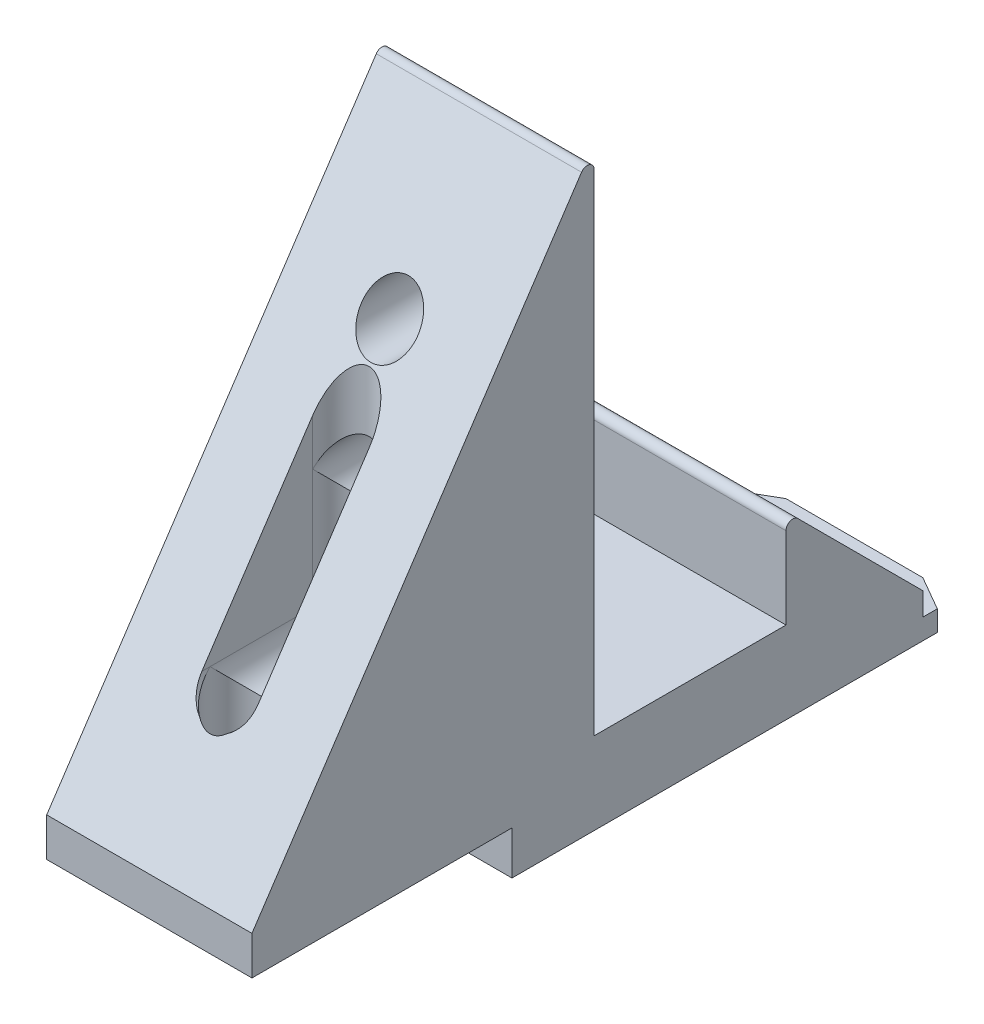
ISO-10303-21;
HEADER;
FILE_DESCRIPTION(('STEP AP214'),'2;1');
FILE_NAME('part.step','',(''),(''),'','','');
FILE_SCHEMA(('AUTOMOTIVE_DESIGN { 1 0 10303 214 1 1 1 1 }'));
ENDSEC;
DATA;
#1=APPLICATION_CONTEXT('core data for automotive mechanical design processes');
#2=APPLICATION_PROTOCOL_DEFINITION('international standard','automotive_design',2000,#1);
#3=PRODUCT_CONTEXT('',#1,'mechanical');
#4=PRODUCT('Part','Part','',(#3));
#5=PRODUCT_RELATED_PRODUCT_CATEGORY('part','',(#4));
#6=PRODUCT_DEFINITION_FORMATION('','',#4);
#7=PRODUCT_DEFINITION_CONTEXT('part definition',#1,'design');
#8=PRODUCT_DEFINITION('design','',#6,#7);
#9=PRODUCT_DEFINITION_SHAPE('','',#8);
#10=(LENGTH_UNIT() NAMED_UNIT(*) SI_UNIT(.MILLI.,.METRE.));
#11=(NAMED_UNIT(*) PLANE_ANGLE_UNIT() SI_UNIT($,.RADIAN.));
#12=(NAMED_UNIT(*) SI_UNIT($,.STERADIAN.) SOLID_ANGLE_UNIT());
#13=UNCERTAINTY_MEASURE_WITH_UNIT(LENGTH_MEASURE(1.E-05),#10,'distance_accuracy_value','');
#14=(GEOMETRIC_REPRESENTATION_CONTEXT(3) GLOBAL_UNCERTAINTY_ASSIGNED_CONTEXT((#13)) GLOBAL_UNIT_ASSIGNED_CONTEXT((#10,
#11,#12)) REPRESENTATION_CONTEXT('',''));
#15=CARTESIAN_POINT('',(0.,0.,0.));
#16=DIRECTION('',(0.,0.,1.));
#17=DIRECTION('',(1.,0.,0.));
#18=AXIS2_PLACEMENT_3D('',#15,#16,#17);
#19=CARTESIAN_POINT('',(0.,23.347224362268,45.35));
#20=DIRECTION('',(0.,0.,-1.));
#21=DIRECTION('',(-1.,0.,0.));
#22=AXIS2_PLACEMENT_3D('',#19,#20,#21);
#23=CYLINDRICAL_SURFACE('',#22,4.125);
#24=DIRECTION('',(0.,0.,1.));
#25=VECTOR('',#24,1.);
#26=CARTESIAN_POINT('',(4.125,23.347224362268,0.));
#27=LINE('',#26,#25);
#28=CARTESIAN_POINT('',(4.125,23.347224362268,37.));
#29=VERTEX_POINT('',#28);
#30=CARTESIAN_POINT('',(4.125,23.347224362268,38.2018504251547));
#31=VERTEX_POINT('',#30);
#32=EDGE_CURVE('E417',#29,#31,#27,.T.);
#33=ORIENTED_EDGE('',*,*,#32,.F.);
#34=CARTESIAN_POINT('',(0.,23.347224362268,37.));
#35=DIRECTION('',(0.,-0.707106781186547,-0.707106781186547));
#36=DIRECTION('',(0.,0.707106781186547,-0.707106781186547));
#37=AXIS2_PLACEMENT_3D('',#34,#35,#36);
#38=ELLIPSE('',#37,5.83363094478902,4.125);
#39=CARTESIAN_POINT('',(2.00390244273514,19.741673086804,40.605551275464));
#40=VERTEX_POINT('',#39);
#41=EDGE_CURVE('E363',#29,#40,#38,.T.);
#42=ORIENTED_EDGE('',*,*,#41,.T.);
#43=CARTESIAN_POINT('',(0.,23.347224362268,38.2018504251547));
#44=DIRECTION('',(0.,-0.554700196225229,-0.832050294337844));
#45=DIRECTION('',(0.,0.832050294337844,-0.554700196225229));
#46=AXIS2_PLACEMENT_3D('',#43,#44,#45);
#47=ELLIPSE('',#46,4.95763300376299,4.125);
#48=EDGE_CURVE('E328',#31,#40,#47,.T.);
#49=ORIENTED_EDGE('',*,*,#48,.F.);
#50=EDGE_LOOP('',(#33,#42,#49));
#51=FACE_BOUND('',#50,.T.);
#52=ADVANCED_FACE('F47',(#51),#23,.F.);
#53=CARTESIAN_POINT('',(15.,5.65,50.));
#54=DIRECTION('',(0.,-0.554700196225229,-0.832050294337844));
#55=DIRECTION('',(0.,0.832050294337844,-0.554700196225229));
#56=AXIS2_PLACEMENT_3D('',#53,#54,#55);
#57=PLANE('',#56);
#58=CARTESIAN_POINT('',(0.,58.347224362268,14.8685170918213));
#59=DIRECTION('',(0.,-0.554700196225229,-0.832050294337844));
#60=DIRECTION('',(0.,0.832050294337844,-0.554700196225229));
#61=AXIS2_PLACEMENT_3D('',#58,#59,#60);
#62=ELLIPSE('',#61,4.95763300376299,4.125);
#63=CARTESIAN_POINT('',(0.,62.472224362268,12.1185170918213));
#64=VERTEX_POINT('',#63);
#65=EDGE_CURVE('E329',#64,#64,#62,.T.);
#66=ORIENTED_EDGE('',*,*,#65,.T.);
#67=EDGE_LOOP('',(#66));
#68=FACE_BOUND('',#67,.T.);
#69=DIRECTION('',(0.,-0.832050294337844,0.554700196225229));
#70=VECTOR('',#69,1.);
#71=CARTESIAN_POINT('',(15.,5.65,50.));
#72=LINE('',#71,#70);
#73=CARTESIAN_POINT('',(15.,77.9019245584932,1.83205029433785));
#74=VERTEX_POINT('',#73);
#75=CARTESIAN_POINT('',(15.,5.65,50.));
#76=VERTEX_POINT('',#75);
#77=EDGE_CURVE('E270',#74,#76,#72,.T.);
#78=ORIENTED_EDGE('',*,*,#77,.F.);
#79=DIRECTION('',(-1.,0.,0.));
#80=VECTOR('',#79,1.);
#81=CARTESIAN_POINT('',(15.,77.9019245584932,1.83205029433785));
#82=LINE('',#81,#80);
#83=CARTESIAN_POINT('',(-15.,77.9019245584932,1.83205029433785));
#84=VERTEX_POINT('',#83);
#85=EDGE_CURVE('E303',#74,#84,#82,.T.);
#86=ORIENTED_EDGE('',*,*,#85,.T.);
#87=DIRECTION('',(0.,-0.832050294337844,0.554700196225229));
#88=VECTOR('',#87,1.);
#89=CARTESIAN_POINT('',(-15.,5.65,50.));
#90=LINE('',#89,#88);
#91=CARTESIAN_POINT('',(-15.,5.65,50.));
#92=VERTEX_POINT('',#91);
#93=EDGE_CURVE('E241',#84,#92,#90,.T.);
#94=ORIENTED_EDGE('',*,*,#93,.T.);
#95=DIRECTION('',(-1.,0.,0.));
#96=VECTOR('',#95,1.);
#97=CARTESIAN_POINT('',(15.,5.65,50.));
#98=LINE('',#97,#96);
#99=EDGE_CURVE('E280',#76,#92,#98,.T.);
#100=ORIENTED_EDGE('',*,*,#99,.F.);
#101=EDGE_LOOP('',(#78,#86,#94,#100));
#102=FACE_BOUND('',#101,.T.);
#103=CARTESIAN_POINT('',(0.,47.65,22.));
#104=DIRECTION('',(0.,-0.554700196225229,-0.832050294337844));
#105=DIRECTION('',(0.,-0.832050294337844,0.554700196225229));
#106=AXIS2_PLACEMENT_3D('',#103,#104,#105);
#107=ELLIPSE('',#106,7.43644950564448,4.125);
#108=CARTESIAN_POINT('',(-4.125,47.65,22.));
#109=VERTEX_POINT('',#108);
#110=CARTESIAN_POINT('',(4.125,47.65,22.));
#111=VERTEX_POINT('',#110);
#112=EDGE_CURVE('E444',#109,#111,#107,.T.);
#113=ORIENTED_EDGE('',*,*,#112,.T.);
#114=DIRECTION('',(0.,-0.832050294337844,0.554700196225229));
#115=VECTOR('',#114,1.);
#116=CARTESIAN_POINT('',(4.125,5.65,50.));
#117=LINE('',#116,#115);
#118=EDGE_CURVE('E431',#111,#31,#117,.T.);
#119=ORIENTED_EDGE('',*,*,#118,.T.);
#120=ORIENTED_EDGE('',*,*,#48,.T.);
#121=CARTESIAN_POINT('',(0.,25.15,37.));
#122=DIRECTION('',(0.,-0.554700196225229,-0.832050294337844));
#123=DIRECTION('',(0.,-0.832050294337844,0.554700196225229));
#124=AXIS2_PLACEMENT_3D('',#121,#122,#123);
#125=ELLIPSE('',#124,7.43644950564448,4.125);
#126=CARTESIAN_POINT('',(-2.00390244273507,19.7416730868039,40.6055512754641));
#127=VERTEX_POINT('',#126);
#128=EDGE_CURVE('E452',#40,#127,#125,.T.);
#129=ORIENTED_EDGE('',*,*,#128,.T.);
#130=CARTESIAN_POINT('',(-4.125,23.347224362268,38.2018504251547));
#131=VERTEX_POINT('',#130);
#132=EDGE_CURVE('E324',#127,#131,#47,.T.);
#133=ORIENTED_EDGE('',*,*,#132,.T.);
#134=DIRECTION('',(0.,-0.832050294337844,0.554700196225229));
#135=VECTOR('',#134,1.);
#136=CARTESIAN_POINT('',(-4.125,5.65,50.));
#137=LINE('',#136,#135);
#138=EDGE_CURVE('E421',#109,#131,#137,.T.);
#139=ORIENTED_EDGE('',*,*,#138,.F.);
#140=EDGE_LOOP('',(#113,#119,#120,#129,#133,#139));
#141=FACE_BOUND('',#140,.T.);
#142=ADVANCED_FACE('F520',(#68,#102,#141),#57,.F.);
#143=CARTESIAN_POINT('',(4.125,23.347224362268,22.));
#144=VERTEX_POINT('',#143);
#145=EDGE_CURVE('E413',#144,#29,#27,.T.);
#146=ORIENTED_EDGE('',*,*,#145,.F.);
#147=CARTESIAN_POINT('',(0.,23.347224362268,22.));
#148=DIRECTION('',(0.,-0.707106781186547,-0.707106781186547));
#149=DIRECTION('',(0.,0.707106781186547,-0.707106781186547));
#150=AXIS2_PLACEMENT_3D('',#147,#148,#149);
#151=ELLIPSE('',#150,5.83363094478902,4.125);
#152=CARTESIAN_POINT('',(-4.125,23.347224362268,22.));
#153=VERTEX_POINT('',#152);
#154=EDGE_CURVE('E347',#144,#153,#151,.T.);
#155=ORIENTED_EDGE('',*,*,#154,.T.);
#156=DIRECTION('',(0.,0.,1.));
#157=VECTOR('',#156,1.);
#158=CARTESIAN_POINT('',(-4.125,23.347224362268,0.));
#159=LINE('',#158,#157);
#160=CARTESIAN_POINT('',(-4.125,23.347224362268,37.));
#161=VERTEX_POINT('',#160);
#162=EDGE_CURVE('E422',#153,#161,#159,.T.);
#163=ORIENTED_EDGE('',*,*,#162,.T.);
#164=CARTESIAN_POINT('',(0.,23.347224362268,37.));
#165=DIRECTION('',(0.,0.707106781186547,-0.707106781186547));
#166=DIRECTION('',(0.,-0.707106781186547,-0.707106781186547));
#167=AXIS2_PLACEMENT_3D('',#164,#165,#166);
#168=ELLIPSE('',#167,5.83363094478902,4.125);
#169=EDGE_CURVE('E355',#161,#29,#168,.F.);
#170=ORIENTED_EDGE('',*,*,#169,.T.);
#171=EDGE_LOOP('',(#146,#155,#163,#170));
#172=FACE_BOUND('',#171,.T.);
#173=ADVANCED_FACE('F540',(#172),#23,.F.);
#174=CARTESIAN_POINT('',(0.,82.35,22.));
#175=DIRECTION('',(0.,-1.,0.));
#176=DIRECTION('',(0.,0.,-1.));
#177=AXIS2_PLACEMENT_3D('',#174,#175,#176);
#178=CYLINDRICAL_SURFACE('',#177,4.125);
#179=CARTESIAN_POINT('',(0.,40.847224362268,22.));
#180=DIRECTION('',(0.,-0.707106781186547,-0.707106781186547));
#181=DIRECTION('',(0.,0.707106781186547,-0.707106781186547));
#182=AXIS2_PLACEMENT_3D('',#179,#180,#181);
#183=ELLIPSE('',#182,5.83363094478902,4.125);
#184=CARTESIAN_POINT('',(4.125,40.847224362268,22.));
#185=VERTEX_POINT('',#184);
#186=CARTESIAN_POINT('',(-4.125,40.847224362268,22.));
#187=VERTEX_POINT('',#186);
#188=EDGE_CURVE('E448',#185,#187,#183,.F.);
#189=ORIENTED_EDGE('',*,*,#188,.F.);
#190=DIRECTION('',(0.,-1.,0.));
#191=VECTOR('',#190,1.);
#192=CARTESIAN_POINT('',(4.125,82.35,22.));
#193=LINE('',#192,#191);
#194=EDGE_CURVE('E367',#185,#111,#193,.F.);
#195=ORIENTED_EDGE('',*,*,#194,.T.);
#196=ORIENTED_EDGE('',*,*,#112,.F.);
#197=DIRECTION('',(0.,-1.,0.));
#198=VECTOR('',#197,1.);
#199=CARTESIAN_POINT('',(-4.125,82.35,22.));
#200=LINE('',#199,#198);
#201=EDGE_CURVE('E364',#187,#109,#200,.F.);
#202=ORIENTED_EDGE('',*,*,#201,.F.);
#203=EDGE_LOOP('',(#189,#195,#196,#202));
#204=FACE_BOUND('',#203,.T.);
#205=ADVANCED_FACE('F552',(#204),#178,.F.);
#206=CARTESIAN_POINT('',(0.,40.847224362268,45.35));
#207=DIRECTION('',(0.,0.,-1.));
#208=DIRECTION('',(-1.,0.,0.));
#209=AXIS2_PLACEMENT_3D('',#206,#207,#208);
#210=CYLINDRICAL_SURFACE('',#209,4.125);
#211=CARTESIAN_POINT('',(0.,40.847224362268,5.));
#212=DIRECTION('',(0.,0.,-1.));
#213=DIRECTION('',(-1.,0.,0.));
#214=AXIS2_PLACEMENT_3D('',#211,#212,#213);
#215=CIRCLE('',#214,4.125);
#216=CARTESIAN_POINT('',(-4.125,40.847224362268,5.));
#217=VERTEX_POINT('',#216);
#218=EDGE_CURVE('E468',#217,#217,#215,.T.);
#219=ORIENTED_EDGE('',*,*,#218,.T.);
#220=EDGE_LOOP('',(#219));
#221=FACE_BOUND('',#220,.T.);
#222=CARTESIAN_POINT('',(0.,40.847224362268,22.));
#223=DIRECTION('',(0.,0.707106781186547,-0.707106781186547));
#224=DIRECTION('',(0.,-0.707106781186547,-0.707106781186547));
#225=AXIS2_PLACEMENT_3D('',#222,#223,#224);
#226=ELLIPSE('',#225,5.83363094478902,4.125);
#227=EDGE_CURVE('E343',#187,#185,#226,.F.);
#228=ORIENTED_EDGE('',*,*,#227,.T.);
#229=ORIENTED_EDGE('',*,*,#188,.T.);
#230=EDGE_LOOP('',(#228,#229));
#231=FACE_BOUND('',#230,.T.);
#232=ADVANCED_FACE('F570',(#221,#231),#210,.F.);
#233=CARTESIAN_POINT('',(0.,23.347224362268,5.));
#234=DIRECTION('',(0.,0.,-1.));
#235=DIRECTION('',(-1.,0.,0.));
#236=AXIS2_PLACEMENT_3D('',#233,#234,#235);
#237=CIRCLE('',#236,4.125);
#238=CARTESIAN_POINT('',(-4.125,23.347224362268,5.));
#239=VERTEX_POINT('',#238);
#240=EDGE_CURVE('E464',#239,#239,#237,.T.);
#241=ORIENTED_EDGE('',*,*,#240,.T.);
#242=EDGE_LOOP('',(#241));
#243=FACE_BOUND('',#242,.T.);
#244=CARTESIAN_POINT('',(0.,23.347224362268,22.));
#245=DIRECTION('',(0.,0.707106781186547,-0.707106781186547));
#246=DIRECTION('',(0.,-0.707106781186547,-0.707106781186547));
#247=AXIS2_PLACEMENT_3D('',#244,#245,#246);
#248=ELLIPSE('',#247,5.83363094478902,4.125);
#249=EDGE_CURVE('E310',#153,#144,#248,.F.);
#250=ORIENTED_EDGE('',*,*,#249,.T.);
#251=CARTESIAN_POINT('',(0.,23.347224362268,22.));
#252=DIRECTION('',(0.,-0.707106781186547,-0.707106781186547));
#253=DIRECTION('',(0.,0.707106781186547,-0.707106781186547));
#254=AXIS2_PLACEMENT_3D('',#251,#252,#253);
#255=ELLIPSE('',#254,5.83363094478902,4.125);
#256=EDGE_CURVE('E351',#144,#153,#255,.F.);
#257=ORIENTED_EDGE('',*,*,#256,.T.);
#258=EDGE_LOOP('',(#250,#257));
#259=FACE_BOUND('',#258,.T.);
#260=ADVANCED_FACE('F554',(#243,#259),#23,.F.);
#261=CARTESIAN_POINT('',(15.,5.65,0.));
#262=DIRECTION('',(0.,0.,1.));
#263=DIRECTION('',(1.,0.,0.));
#264=AXIS2_PLACEMENT_3D('',#261,#262,#263);
#265=PLANE('',#264);
#266=CARTESIAN_POINT('',(0.,58.347224362268,0.));
#267=DIRECTION('',(0.,0.,-1.));
#268=DIRECTION('',(-1.,0.,0.));
#269=AXIS2_PLACEMENT_3D('',#266,#267,#268);
#270=CIRCLE('',#269,2.24999999999999);
#271=CARTESIAN_POINT('',(-2.24999999999999,58.347224362268,0.));
#272=VERTEX_POINT('',#271);
#273=EDGE_CURVE('E333',#272,#272,#270,.T.);
#274=ORIENTED_EDGE('',*,*,#273,.F.);
#275=EDGE_LOOP('',(#274));
#276=FACE_BOUND('',#275,.T.);
#277=CARTESIAN_POINT('',(0.,40.847224362268,0.));
#278=DIRECTION('',(0.,0.,-1.));
#279=DIRECTION('',(-1.,0.,0.));
#280=AXIS2_PLACEMENT_3D('',#277,#278,#279);
#281=CIRCLE('',#280,2.24999999999999);
#282=CARTESIAN_POINT('',(-2.24999999999999,40.847224362268,0.));
#283=VERTEX_POINT('',#282);
#284=EDGE_CURVE('E478',#283,#283,#281,.T.);
#285=ORIENTED_EDGE('',*,*,#284,.F.);
#286=EDGE_LOOP('',(#285));
#287=FACE_BOUND('',#286,.T.);
#288=DIRECTION('',(0.,1.,0.));
#289=VECTOR('',#288,1.);
#290=CARTESIAN_POINT('',(-15.,5.65,0.));
#291=LINE('',#290,#289);
#292=CARTESIAN_POINT('',(-15.,5.65,0.));
#293=VERTEX_POINT('',#292);
#294=CARTESIAN_POINT('',(-15.,77.347224362268,0.));
#295=VERTEX_POINT('',#294);
#296=EDGE_CURVE('E266',#293,#295,#291,.T.);
#297=ORIENTED_EDGE('',*,*,#296,.T.);
#298=DIRECTION('',(-1.,0.,0.));
#299=VECTOR('',#298,1.);
#300=CARTESIAN_POINT('',(15.,77.347224362268,0.));
#301=LINE('',#300,#299);
#302=CARTESIAN_POINT('',(15.,77.347224362268,0.));
#303=VERTEX_POINT('',#302);
#304=EDGE_CURVE('E307',#295,#303,#301,.F.);
#305=ORIENTED_EDGE('',*,*,#304,.T.);
#306=DIRECTION('',(0.,1.,0.));
#307=VECTOR('',#306,1.);
#308=CARTESIAN_POINT('',(15.,5.65,0.));
#309=LINE('',#308,#307);
#310=CARTESIAN_POINT('',(15.,5.65,0.));
#311=VERTEX_POINT('',#310);
#312=EDGE_CURVE('E236',#311,#303,#309,.T.);
#313=ORIENTED_EDGE('',*,*,#312,.F.);
#314=DIRECTION('',(-1.,0.,0.));
#315=VECTOR('',#314,1.);
#316=CARTESIAN_POINT('',(15.,5.65,0.));
#317=LINE('',#316,#315);
#318=EDGE_CURVE('E240',#311,#293,#317,.T.);
#319=ORIENTED_EDGE('',*,*,#318,.T.);
#320=EDGE_LOOP('',(#297,#305,#313,#319));
#321=FACE_BOUND('',#320,.T.);
#322=CARTESIAN_POINT('',(0.,23.347224362268,0.));
#323=DIRECTION('',(0.,0.,-1.));
#324=DIRECTION('',(-1.,0.,0.));
#325=AXIS2_PLACEMENT_3D('',#322,#323,#324);
#326=CIRCLE('',#325,2.24999999999999);
#327=CARTESIAN_POINT('',(-2.24999999999999,23.347224362268,0.));
#328=VERTEX_POINT('',#327);
#329=EDGE_CURVE('E482',#328,#328,#326,.T.);
#330=ORIENTED_EDGE('',*,*,#329,.F.);
#331=EDGE_LOOP('',(#330));
#332=FACE_BOUND('',#331,.T.);
#333=ADVANCED_FACE('F569',(#276,#287,#321,#332),#265,.F.);
#334=CARTESIAN_POINT('',(15.,0.,50.));
#335=DIRECTION('',(0.,0.,-1.));
#336=DIRECTION('',(-1.,0.,0.));
#337=AXIS2_PLACEMENT_3D('',#334,#335,#336);
#338=PLANE('',#337);
#339=DIRECTION('',(-1.,0.,0.));
#340=VECTOR('',#339,1.);
#341=CARTESIAN_POINT('',(-15.,0.,50.));
#342=LINE('',#341,#340);
#343=CARTESIAN_POINT('',(15.,0.,50.));
#344=VERTEX_POINT('',#343);
#345=CARTESIAN_POINT('',(-15.,0.,50.));
#346=VERTEX_POINT('',#345);
#347=EDGE_CURVE('E498',#344,#346,#342,.T.);
#348=ORIENTED_EDGE('',*,*,#347,.F.);
#349=DIRECTION('',(0.,-1.,0.));
#350=VECTOR('',#349,1.);
#351=CARTESIAN_POINT('',(15.,0.,50.));
#352=LINE('',#351,#350);
#353=EDGE_CURVE('E227',#76,#344,#352,.T.);
#354=ORIENTED_EDGE('',*,*,#353,.F.);
#355=ORIENTED_EDGE('',*,*,#99,.T.);
#356=DIRECTION('',(0.,-1.,0.));
#357=VECTOR('',#356,1.);
#358=CARTESIAN_POINT('',(-15.,0.,50.));
#359=LINE('',#358,#357);
#360=EDGE_CURVE('E244',#92,#346,#359,.T.);
#361=ORIENTED_EDGE('',*,*,#360,.T.);
#362=EDGE_LOOP('',(#348,#354,#355,#361));
#363=FACE_BOUND('',#362,.T.);
#364=ADVANCED_FACE('F518',(#363),#338,.F.);
#365=CARTESIAN_POINT('',(15.,-6.35,50.));
#366=DIRECTION('',(0.,1.,0.));
#367=DIRECTION('',(0.,0.,1.));
#368=AXIS2_PLACEMENT_3D('',#365,#366,#367);
#369=PLANE('',#368);
#370=DIRECTION('',(0.,0.,-1.));
#371=VECTOR('',#370,1.);
#372=CARTESIAN_POINT('',(-15.,-6.35,50.));
#373=LINE('',#372,#371);
#374=CARTESIAN_POINT('',(-15.,-6.35,12.));
#375=VERTEX_POINT('',#374);
#376=CARTESIAN_POINT('',(-15.,-6.35,-50.1632486540519));
#377=VERTEX_POINT('',#376);
#378=EDGE_CURVE('E249',#375,#377,#373,.T.);
#379=ORIENTED_EDGE('',*,*,#378,.T.);
#380=DIRECTION('',(0.86602540378444,0.,-0.499999999999998));
#381=VECTOR('',#380,1.);
#382=CARTESIAN_POINT('',(-15.,-6.35,-50.1632486540519));
#383=LINE('',#382,#381);
#384=CARTESIAN_POINT('',(-9.99999999999996,-6.35,-53.05));
#385=VERTEX_POINT('',#384);
#386=EDGE_CURVE('E378',#377,#385,#383,.T.);
#387=ORIENTED_EDGE('',*,*,#386,.T.);
#388=DIRECTION('',(1.,0.,0.));
#389=VECTOR('',#388,1.);
#390=CARTESIAN_POINT('',(-15.,-6.35,-53.05));
#391=LINE('',#390,#389);
#392=CARTESIAN_POINT('',(9.99999999999995,-6.35,-53.05));
#393=VERTEX_POINT('',#392);
#394=EDGE_CURVE('E399',#385,#393,#391,.T.);
#395=ORIENTED_EDGE('',*,*,#394,.T.);
#396=DIRECTION('',(-0.86602540378444,0.,-0.499999999999998));
#397=VECTOR('',#396,1.);
#398=CARTESIAN_POINT('',(9.99999999999995,-6.35,-53.05));
#399=LINE('',#398,#397);
#400=CARTESIAN_POINT('',(15.,-6.35,-50.1632486540519));
#401=VERTEX_POINT('',#400);
#402=EDGE_CURVE('E375',#393,#401,#399,.F.);
#403=ORIENTED_EDGE('',*,*,#402,.T.);
#404=DIRECTION('',(0.,0.,-1.));
#405=VECTOR('',#404,1.);
#406=CARTESIAN_POINT('',(15.,-6.35,50.));
#407=LINE('',#406,#405);
#408=CARTESIAN_POINT('',(15.,-6.35,12.));
#409=VERTEX_POINT('',#408);
#410=EDGE_CURVE('E221',#409,#401,#407,.T.);
#411=ORIENTED_EDGE('',*,*,#410,.F.);
#412=DIRECTION('',(1.,0.,0.));
#413=VECTOR('',#412,1.);
#414=CARTESIAN_POINT('',(-15.,-6.35,12.));
#415=LINE('',#414,#413);
#416=EDGE_CURVE('E486',#375,#409,#415,.T.);
#417=ORIENTED_EDGE('',*,*,#416,.F.);
#418=EDGE_LOOP('',(#379,#387,#395,#403,#411,#417));
#419=FACE_BOUND('',#418,.T.);
#420=ADVANCED_FACE('F405',(#419),#369,.F.);
#421=CARTESIAN_POINT('',(15.,0.,-48.05));
#422=DIRECTION('',(0.,0.,1.));
#423=DIRECTION('',(0.,-1.,0.));
#424=AXIS2_PLACEMENT_3D('',#421,#422,#423);
#425=PLANE('',#424);
#426=DIRECTION('',(0.,1.,0.));
#427=VECTOR('',#426,1.);
#428=CARTESIAN_POINT('',(15.,0.,-48.05));
#429=LINE('',#428,#427);
#430=CARTESIAN_POINT('',(15.,-3.35,-48.05));
#431=VERTEX_POINT('',#430);
#432=CARTESIAN_POINT('',(15.,0.,-48.05));
#433=VERTEX_POINT('',#432);
#434=EDGE_CURVE('E200',#431,#433,#429,.T.);
#435=ORIENTED_EDGE('',*,*,#434,.F.);
#436=DIRECTION('',(-1.,0.,0.));
#437=VECTOR('',#436,1.);
#438=CARTESIAN_POINT('',(-15.,-3.35,-48.05));
#439=LINE('',#438,#437);
#440=CARTESIAN_POINT('',(-15.,-3.35,-48.05));
#441=VERTEX_POINT('',#440);
#442=EDGE_CURVE('E203',#431,#441,#439,.T.);
#443=ORIENTED_EDGE('',*,*,#442,.T.);
#444=DIRECTION('',(0.,1.,0.));
#445=VECTOR('',#444,1.);
#446=CARTESIAN_POINT('',(-15.,0.,-48.05));
#447=LINE('',#446,#445);
#448=CARTESIAN_POINT('',(-15.,0.,-48.05));
#449=VERTEX_POINT('',#448);
#450=EDGE_CURVE('E253',#441,#449,#447,.T.);
#451=ORIENTED_EDGE('',*,*,#450,.T.);
#452=DIRECTION('',(-1.,0.,0.));
#453=VECTOR('',#452,1.);
#454=CARTESIAN_POINT('',(15.,0.,-48.05));
#455=LINE('',#454,#453);
#456=EDGE_CURVE('E217',#433,#449,#455,.T.);
#457=ORIENTED_EDGE('',*,*,#456,.F.);
#458=EDGE_LOOP('',(#435,#443,#451,#457));
#459=FACE_BOUND('',#458,.T.);
#460=ADVANCED_FACE('F215',(#459),#425,.F.);
#461=CARTESIAN_POINT('',(15.,0.,-48.05));
#462=DIRECTION('',(0.,-0.707106781186547,0.707106781186547));
#463=DIRECTION('',(0.,-0.707106781186548,-0.707106781186548));
#464=AXIS2_PLACEMENT_3D('',#461,#462,#463);
#465=PLANE('',#464);
#466=DIRECTION('',(0.,0.707106781186548,0.707106781186548));
#467=VECTOR('',#466,1.);
#468=CARTESIAN_POINT('',(-15.,0.,-48.05));
#469=LINE('',#468,#467);
#470=CARTESIAN_POINT('',(-15.,18.2928932188135,-29.7571067811865));
#471=VERTEX_POINT('',#470);
#472=EDGE_CURVE('E256',#449,#471,#469,.T.);
#473=ORIENTED_EDGE('',*,*,#472,.T.);
#474=DIRECTION('',(-1.,0.,0.));
#475=VECTOR('',#474,1.);
#476=CARTESIAN_POINT('',(15.,18.2928932188135,-29.7571067811865));
#477=LINE('',#476,#475);
#478=CARTESIAN_POINT('',(15.,18.2928932188135,-29.7571067811865));
#479=VERTEX_POINT('',#478);
#480=EDGE_CURVE('E294',#471,#479,#477,.F.);
#481=ORIENTED_EDGE('',*,*,#480,.T.);
#482=DIRECTION('',(0.,0.707106781186548,0.707106781186548));
#483=VECTOR('',#482,1.);
#484=CARTESIAN_POINT('',(15.,0.,-48.05));
#485=LINE('',#484,#483);
#486=EDGE_CURVE('E220',#433,#479,#485,.T.);
#487=ORIENTED_EDGE('',*,*,#486,.F.);
#488=ORIENTED_EDGE('',*,*,#456,.T.);
#489=EDGE_LOOP('',(#473,#481,#487,#488));
#490=FACE_BOUND('',#489,.T.);
#491=ADVANCED_FACE('F702',(#490),#465,.F.);
#492=CARTESIAN_POINT('',(15.,5.65,-28.05));
#493=DIRECTION('',(0.,0.,-1.));
#494=DIRECTION('',(0.,1.,0.));
#495=AXIS2_PLACEMENT_3D('',#492,#493,#494);
#496=PLANE('',#495);
#497=DIRECTION('',(0.,-1.,0.));
#498=VECTOR('',#497,1.);
#499=CARTESIAN_POINT('',(15.,5.65,-28.05));
#500=LINE('',#499,#498);
#501=CARTESIAN_POINT('',(15.,17.5857864376269,-28.05));
#502=VERTEX_POINT('',#501);
#503=CARTESIAN_POINT('',(15.,5.65,-28.05));
#504=VERTEX_POINT('',#503);
#505=EDGE_CURVE('E225',#502,#504,#500,.T.);
#506=ORIENTED_EDGE('',*,*,#505,.F.);
#507=DIRECTION('',(-1.,0.,0.));
#508=VECTOR('',#507,1.);
#509=CARTESIAN_POINT('',(15.,17.5857864376269,-28.05));
#510=LINE('',#509,#508);
#511=CARTESIAN_POINT('',(-15.,17.5857864376269,-28.05));
#512=VERTEX_POINT('',#511);
#513=EDGE_CURVE('E284',#502,#512,#510,.T.);
#514=ORIENTED_EDGE('',*,*,#513,.T.);
#515=DIRECTION('',(0.,-1.,0.));
#516=VECTOR('',#515,1.);
#517=CARTESIAN_POINT('',(-15.,5.65,-28.05));
#518=LINE('',#517,#516);
#519=CARTESIAN_POINT('',(-15.,5.65,-28.05));
#520=VERTEX_POINT('',#519);
#521=EDGE_CURVE('E260',#512,#520,#518,.T.);
#522=ORIENTED_EDGE('',*,*,#521,.T.);
#523=DIRECTION('',(-1.,0.,0.));
#524=VECTOR('',#523,1.);
#525=CARTESIAN_POINT('',(15.,5.65,-28.05));
#526=LINE('',#525,#524);
#527=EDGE_CURVE('E274',#504,#520,#526,.T.);
#528=ORIENTED_EDGE('',*,*,#527,.F.);
#529=EDGE_LOOP('',(#506,#514,#522,#528));
#530=FACE_BOUND('',#529,.T.);
#531=ADVANCED_FACE('F698',(#530),#496,.F.);
#532=CARTESIAN_POINT('',(15.,5.65,0.));
#533=DIRECTION('',(0.,-1.,0.));
#534=DIRECTION('',(0.,0.,-1.));
#535=AXIS2_PLACEMENT_3D('',#532,#533,#534);
#536=PLANE('',#535);
#537=DIRECTION('',(0.,0.,1.));
#538=VECTOR('',#537,1.);
#539=CARTESIAN_POINT('',(-15.,5.65,0.));
#540=LINE('',#539,#538);
#541=EDGE_CURVE('E263',#520,#293,#540,.T.);
#542=ORIENTED_EDGE('',*,*,#541,.T.);
#543=ORIENTED_EDGE('',*,*,#318,.F.);
#544=DIRECTION('',(0.,0.,1.));
#545=VECTOR('',#544,1.);
#546=CARTESIAN_POINT('',(15.,5.65,0.));
#547=LINE('',#546,#545);
#548=EDGE_CURVE('E233',#504,#311,#547,.T.);
#549=ORIENTED_EDGE('',*,*,#548,.F.);
#550=ORIENTED_EDGE('',*,*,#527,.T.);
#551=EDGE_LOOP('',(#542,#543,#549,#550));
#552=FACE_BOUND('',#551,.T.);
#553=ADVANCED_FACE('F692',(#552),#536,.F.);
#554=CARTESIAN_POINT('',(15.,0.,0.));
#555=DIRECTION('',(1.,0.,0.));
#556=DIRECTION('',(0.,0.,-1.));
#557=AXIS2_PLACEMENT_3D('',#554,#555,#556);
#558=PLANE('',#557);
#559=ORIENTED_EDGE('',*,*,#410,.T.);
#560=DIRECTION('',(0.,1.,0.));
#561=VECTOR('',#560,1.);
#562=CARTESIAN_POINT('',(15.,0.,-50.1632486540519));
#563=LINE('',#562,#561);
#564=CARTESIAN_POINT('',(15.,-3.35,-50.1632486540519));
#565=VERTEX_POINT('',#564);
#566=EDGE_CURVE('E11',#401,#565,#563,.T.);
#567=ORIENTED_EDGE('',*,*,#566,.T.);
#568=DIRECTION('',(0.,0.,1.));
#569=VECTOR('',#568,1.);
#570=CARTESIAN_POINT('',(15.,-3.35,-48.05));
#571=LINE('',#570,#569);
#572=EDGE_CURVE('E195',#565,#431,#571,.T.);
#573=ORIENTED_EDGE('',*,*,#572,.T.);
#574=ORIENTED_EDGE('',*,*,#434,.T.);
#575=ORIENTED_EDGE('',*,*,#486,.T.);
#576=CARTESIAN_POINT('',(15.,17.5857864376269,-29.05));
#577=DIRECTION('',(1.,0.,0.));
#578=DIRECTION('',(0.,0.,-1.));
#579=AXIS2_PLACEMENT_3D('',#576,#577,#578);
#580=CIRCLE('',#579,1.);
#581=EDGE_CURVE('E300',#479,#502,#580,.T.);
#582=ORIENTED_EDGE('',*,*,#581,.T.);
#583=ORIENTED_EDGE('',*,*,#505,.T.);
#584=ORIENTED_EDGE('',*,*,#548,.T.);
#585=ORIENTED_EDGE('',*,*,#312,.T.);
#586=CARTESIAN_POINT('',(15.,77.347224362268,1.00000000000001));
#587=DIRECTION('',(1.,0.,0.));
#588=DIRECTION('',(0.,0.,-1.));
#589=AXIS2_PLACEMENT_3D('',#586,#587,#588);
#590=CIRCLE('',#589,1.);
#591=EDGE_CURVE('E297',#303,#74,#590,.T.);
#592=ORIENTED_EDGE('',*,*,#591,.T.);
#593=ORIENTED_EDGE('',*,*,#77,.T.);
#594=ORIENTED_EDGE('',*,*,#353,.T.);
#595=DIRECTION('',(0.,0.,1.));
#596=VECTOR('',#595,1.);
#597=CARTESIAN_POINT('',(15.,0.,50.));
#598=LINE('',#597,#596);
#599=CARTESIAN_POINT('',(15.,0.,12.));
#600=VERTEX_POINT('',#599);
#601=EDGE_CURVE('E495',#600,#344,#598,.T.);
#602=ORIENTED_EDGE('',*,*,#601,.F.);
#603=DIRECTION('',(0.,-1.,0.));
#604=VECTOR('',#603,1.);
#605=CARTESIAN_POINT('',(15.,0.,12.));
#606=LINE('',#605,#604);
#607=EDGE_CURVE('E245',#600,#409,#606,.T.);
#608=ORIENTED_EDGE('',*,*,#607,.T.);
#609=EDGE_LOOP('',(#559,#567,#573,#574,#575,#582,#583,#584,#585,#592,#593,#594,#602,#608));
#610=FACE_BOUND('',#609,.T.);
#611=ADVANCED_FACE('F197',(#610),#558,.T.);
#612=CARTESIAN_POINT('',(-15.,0.,0.));
#613=DIRECTION('',(1.,0.,0.));
#614=DIRECTION('',(0.,0.,-1.));
#615=AXIS2_PLACEMENT_3D('',#612,#613,#614);
#616=PLANE('',#615);
#617=DIRECTION('',(0.,0.,-1.));
#618=VECTOR('',#617,1.);
#619=CARTESIAN_POINT('',(-15.,-3.35,-48.05));
#620=LINE('',#619,#618);
#621=CARTESIAN_POINT('',(-15.,-3.35,-50.1632486540519));
#622=VERTEX_POINT('',#621);
#623=EDGE_CURVE('E209',#441,#622,#620,.T.);
#624=ORIENTED_EDGE('',*,*,#623,.T.);
#625=DIRECTION('',(0.,-1.,0.));
#626=VECTOR('',#625,1.);
#627=CARTESIAN_POINT('',(-15.,-6.35,-50.1632486540519));
#628=LINE('',#627,#626);
#629=EDGE_CURVE('E371',#622,#377,#628,.T.);
#630=ORIENTED_EDGE('',*,*,#629,.T.);
#631=ORIENTED_EDGE('',*,*,#378,.F.);
#632=DIRECTION('',(0.,-1.,0.));
#633=VECTOR('',#632,1.);
#634=CARTESIAN_POINT('',(-15.,0.,12.));
#635=LINE('',#634,#633);
#636=CARTESIAN_POINT('',(-15.,0.,12.));
#637=VERTEX_POINT('',#636);
#638=EDGE_CURVE('E501',#637,#375,#635,.T.);
#639=ORIENTED_EDGE('',*,*,#638,.F.);
#640=DIRECTION('',(0.,0.,-1.));
#641=VECTOR('',#640,1.);
#642=CARTESIAN_POINT('',(-15.,0.,50.));
#643=LINE('',#642,#641);
#644=EDGE_CURVE('E487',#346,#637,#643,.T.);
#645=ORIENTED_EDGE('',*,*,#644,.F.);
#646=ORIENTED_EDGE('',*,*,#360,.F.);
#647=ORIENTED_EDGE('',*,*,#93,.F.);
#648=CARTESIAN_POINT('',(-15.,77.347224362268,1.00000000000001));
#649=DIRECTION('',(1.,0.,0.));
#650=DIRECTION('',(0.,0.,-1.));
#651=AXIS2_PLACEMENT_3D('',#648,#649,#650);
#652=CIRCLE('',#651,1.);
#653=EDGE_CURVE('E288',#84,#295,#652,.F.);
#654=ORIENTED_EDGE('',*,*,#653,.T.);
#655=ORIENTED_EDGE('',*,*,#296,.F.);
#656=ORIENTED_EDGE('',*,*,#541,.F.);
#657=ORIENTED_EDGE('',*,*,#521,.F.);
#658=CARTESIAN_POINT('',(-15.,17.5857864376269,-29.05));
#659=DIRECTION('',(1.,0.,0.));
#660=DIRECTION('',(0.,0.,-1.));
#661=AXIS2_PLACEMENT_3D('',#658,#659,#660);
#662=CIRCLE('',#661,1.);
#663=EDGE_CURVE('E291',#512,#471,#662,.F.);
#664=ORIENTED_EDGE('',*,*,#663,.T.);
#665=ORIENTED_EDGE('',*,*,#472,.F.);
#666=ORIENTED_EDGE('',*,*,#450,.F.);
#667=EDGE_LOOP('',(#624,#630,#631,#639,#645,#646,#647,#654,#655,#656,#657,#664,#665,#666));
#668=FACE_BOUND('',#667,.T.);
#669=ADVANCED_FACE('F395',(#668),#616,.F.);
#670=CARTESIAN_POINT('',(15.,17.5857864376269,-29.05));
#671=DIRECTION('',(-1.,0.,0.));
#672=DIRECTION('',(0.,0.,1.));
#673=AXIS2_PLACEMENT_3D('',#670,#671,#672);
#674=CYLINDRICAL_SURFACE('',#673,1.);
#675=ORIENTED_EDGE('',*,*,#581,.F.);
#676=ORIENTED_EDGE('',*,*,#480,.F.);
#677=ORIENTED_EDGE('',*,*,#663,.F.);
#678=ORIENTED_EDGE('',*,*,#513,.F.);
#679=EDGE_LOOP('',(#675,#676,#677,#678));
#680=FACE_BOUND('',#679,.T.);
#681=ADVANCED_FACE('F694',(#680),#674,.T.);
#682=CARTESIAN_POINT('',(15.,77.347224362268,1.00000000000001));
#683=DIRECTION('',(-1.,0.,0.));
#684=DIRECTION('',(0.,0.,1.));
#685=AXIS2_PLACEMENT_3D('',#682,#683,#684);
#686=CYLINDRICAL_SURFACE('',#685,1.);
#687=ORIENTED_EDGE('',*,*,#591,.F.);
#688=ORIENTED_EDGE('',*,*,#304,.F.);
#689=ORIENTED_EDGE('',*,*,#653,.F.);
#690=ORIENTED_EDGE('',*,*,#85,.F.);
#691=EDGE_LOOP('',(#687,#688,#689,#690));
#692=FACE_BOUND('',#691,.T.);
#693=ADVANCED_FACE('F689',(#692),#686,.T.);
#694=CARTESIAN_POINT('',(-15.,0.,12.));
#695=DIRECTION('',(0.,0.,-1.));
#696=DIRECTION('',(-1.,0.,0.));
#697=AXIS2_PLACEMENT_3D('',#694,#695,#696);
#698=PLANE('',#697);
#699=ORIENTED_EDGE('',*,*,#416,.T.);
#700=ORIENTED_EDGE('',*,*,#607,.F.);
#701=DIRECTION('',(1.,0.,0.));
#702=VECTOR('',#701,1.);
#703=CARTESIAN_POINT('',(-15.,0.,12.));
#704=LINE('',#703,#702);
#705=EDGE_CURVE('E491',#637,#600,#704,.T.);
#706=ORIENTED_EDGE('',*,*,#705,.F.);
#707=ORIENTED_EDGE('',*,*,#638,.T.);
#708=EDGE_LOOP('',(#699,#700,#706,#707));
#709=FACE_BOUND('',#708,.T.);
#710=ADVANCED_FACE('F530',(#709),#698,.F.);
#711=CARTESIAN_POINT('',(0.,0.,0.));
#712=DIRECTION('',(0.,-1.,0.));
#713=DIRECTION('',(0.,0.,-1.));
#714=AXIS2_PLACEMENT_3D('',#711,#712,#713);
#715=PLANE('',#714);
#716=CARTESIAN_POINT('',(0.,0.,37.));
#717=DIRECTION('',(0.,-1.,0.));
#718=DIRECTION('',(0.,0.,-1.));
#719=AXIS2_PLACEMENT_3D('',#716,#717,#718);
#720=CIRCLE('',#719,2.24999999999999);
#721=CARTESIAN_POINT('',(0.,0.,34.75));
#722=VERTEX_POINT('',#721);
#723=EDGE_CURVE('E456',#722,#722,#720,.T.);
#724=ORIENTED_EDGE('',*,*,#723,.F.);
#725=EDGE_LOOP('',(#724));
#726=FACE_BOUND('',#725,.T.);
#727=CARTESIAN_POINT('',(0.,0.,22.));
#728=DIRECTION('',(0.,-1.,0.));
#729=DIRECTION('',(0.,0.,-1.));
#730=AXIS2_PLACEMENT_3D('',#727,#728,#729);
#731=CIRCLE('',#730,2.24999999999999);
#732=CARTESIAN_POINT('',(0.,0.,19.75));
#733=VERTEX_POINT('',#732);
#734=EDGE_CURVE('E460',#733,#733,#731,.T.);
#735=ORIENTED_EDGE('',*,*,#734,.F.);
#736=EDGE_LOOP('',(#735));
#737=FACE_BOUND('',#736,.T.);
#738=ORIENTED_EDGE('',*,*,#644,.T.);
#739=ORIENTED_EDGE('',*,*,#705,.T.);
#740=ORIENTED_EDGE('',*,*,#601,.T.);
#741=ORIENTED_EDGE('',*,*,#347,.T.);
#742=EDGE_LOOP('',(#738,#739,#740,#741));
#743=FACE_BOUND('',#742,.T.);
#744=ADVANCED_FACE('F528',(#726,#737,#743),#715,.T.);
#745=CARTESIAN_POINT('',(0.,23.347224362268,0.));
#746=DIRECTION('',(0.,0.,-1.));
#747=DIRECTION('',(-1.,0.,0.));
#748=AXIS2_PLACEMENT_3D('',#745,#746,#747);
#749=CYLINDRICAL_SURFACE('',#748,2.24999999999999);
#750=CARTESIAN_POINT('',(0.,23.347224362268,5.));
#751=DIRECTION('',(0.,0.,-1.));
#752=DIRECTION('',(-1.,0.,0.));
#753=AXIS2_PLACEMENT_3D('',#750,#751,#752);
#754=CIRCLE('',#753,2.24999999999999);
#755=CARTESIAN_POINT('',(-2.24999999999999,23.347224362268,5.));
#756=VERTEX_POINT('',#755);
#757=EDGE_CURVE('E320',#756,#756,#754,.F.);
#758=ORIENTED_EDGE('',*,*,#757,.T.);
#759=EDGE_LOOP('',(#758));
#760=FACE_BOUND('',#759,.T.);
#761=ORIENTED_EDGE('',*,*,#329,.T.);
#762=EDGE_LOOP('',(#761));
#763=FACE_BOUND('',#762,.T.);
#764=ADVANCED_FACE('F674',(#760,#763),#749,.F.);
#765=CARTESIAN_POINT('',(0.,40.847224362268,0.));
#766=DIRECTION('',(0.,0.,-1.));
#767=DIRECTION('',(-1.,0.,0.));
#768=AXIS2_PLACEMENT_3D('',#765,#766,#767);
#769=CYLINDRICAL_SURFACE('',#768,2.24999999999999);
#770=CARTESIAN_POINT('',(0.,40.847224362268,5.));
#771=DIRECTION('',(0.,0.,-1.));
#772=DIRECTION('',(-1.,0.,0.));
#773=AXIS2_PLACEMENT_3D('',#770,#771,#772);
#774=CIRCLE('',#773,2.24999999999999);
#775=CARTESIAN_POINT('',(-2.24999999999999,40.847224362268,5.));
#776=VERTEX_POINT('',#775);
#777=EDGE_CURVE('E315',#776,#776,#774,.F.);
#778=ORIENTED_EDGE('',*,*,#777,.T.);
#779=EDGE_LOOP('',(#778));
#780=FACE_BOUND('',#779,.T.);
#781=ORIENTED_EDGE('',*,*,#284,.T.);
#782=EDGE_LOOP('',(#781));
#783=FACE_BOUND('',#782,.T.);
#784=ADVANCED_FACE('F656',(#780,#783),#769,.F.);
#785=CARTESIAN_POINT('',(0.,58.347224362268,0.));
#786=DIRECTION('',(0.,0.,-1.));
#787=DIRECTION('',(-1.,0.,0.));
#788=AXIS2_PLACEMENT_3D('',#785,#786,#787);
#789=CYLINDRICAL_SURFACE('',#788,2.24999999999999);
#790=CARTESIAN_POINT('',(0.,58.347224362268,5.));
#791=DIRECTION('',(0.,0.,-1.));
#792=DIRECTION('',(-1.,0.,0.));
#793=AXIS2_PLACEMENT_3D('',#790,#791,#792);
#794=CIRCLE('',#793,2.24999999999999);
#795=CARTESIAN_POINT('',(-2.24999999999999,58.347224362268,5.));
#796=VERTEX_POINT('',#795);
#797=EDGE_CURVE('E311',#796,#796,#794,.F.);
#798=ORIENTED_EDGE('',*,*,#797,.T.);
#799=EDGE_LOOP('',(#798));
#800=FACE_BOUND('',#799,.T.);
#801=ORIENTED_EDGE('',*,*,#273,.T.);
#802=EDGE_LOOP('',(#801));
#803=FACE_BOUND('',#802,.T.);
#804=ADVANCED_FACE('F651',(#800,#803),#789,.F.);
#805=CARTESIAN_POINT('',(0.,58.347224362268,45.35));
#806=DIRECTION('',(0.,0.,-1.));
#807=DIRECTION('',(-1.,0.,0.));
#808=AXIS2_PLACEMENT_3D('',#805,#806,#807);
#809=CYLINDRICAL_SURFACE('',#808,4.125);
#810=CARTESIAN_POINT('',(0.,58.347224362268,5.));
#811=DIRECTION('',(0.,0.,-1.));
#812=DIRECTION('',(-1.,0.,0.));
#813=AXIS2_PLACEMENT_3D('',#810,#811,#812);
#814=CIRCLE('',#813,4.125);
#815=CARTESIAN_POINT('',(-4.125,58.347224362268,5.));
#816=VERTEX_POINT('',#815);
#817=EDGE_CURVE('E316',#816,#816,#814,.T.);
#818=ORIENTED_EDGE('',*,*,#817,.T.);
#819=EDGE_LOOP('',(#818));
#820=FACE_BOUND('',#819,.T.);
#821=ORIENTED_EDGE('',*,*,#65,.F.);
#822=EDGE_LOOP('',(#821));
#823=FACE_BOUND('',#822,.T.);
#824=ADVANCED_FACE('F648',(#820,#823),#809,.F.);
#825=CARTESIAN_POINT('',(0.,58.347224362268,5.));
#826=DIRECTION('',(0.,0.,-1.));
#827=DIRECTION('',(-1.,0.,0.));
#828=AXIS2_PLACEMENT_3D('',#825,#826,#827);
#829=PLANE('',#828);
#830=ORIENTED_EDGE('',*,*,#817,.F.);
#831=EDGE_LOOP('',(#830));
#832=FACE_BOUND('',#831,.T.);
#833=ORIENTED_EDGE('',*,*,#797,.F.);
#834=EDGE_LOOP('',(#833));
#835=FACE_BOUND('',#834,.T.);
#836=ADVANCED_FACE('F567',(#832,#835),#829,.F.);
#837=CARTESIAN_POINT('',(0.,40.847224362268,5.));
#838=DIRECTION('',(0.,0.,-1.));
#839=DIRECTION('',(-1.,0.,0.));
#840=AXIS2_PLACEMENT_3D('',#837,#838,#839);
#841=PLANE('',#840);
#842=ORIENTED_EDGE('',*,*,#218,.F.);
#843=EDGE_LOOP('',(#842));
#844=FACE_BOUND('',#843,.T.);
#845=ORIENTED_EDGE('',*,*,#777,.F.);
#846=EDGE_LOOP('',(#845));
#847=FACE_BOUND('',#846,.T.);
#848=ADVANCED_FACE('F557',(#844,#847),#841,.F.);
#849=EDGE_CURVE('E359',#127,#161,#38,.T.);
#850=ORIENTED_EDGE('',*,*,#849,.T.);
#851=EDGE_CURVE('E213',#161,#131,#159,.T.);
#852=ORIENTED_EDGE('',*,*,#851,.T.);
#853=ORIENTED_EDGE('',*,*,#132,.F.);
#854=EDGE_LOOP('',(#850,#852,#853));
#855=FACE_BOUND('',#854,.T.);
#856=ADVANCED_FACE('F541',(#855),#23,.F.);
#857=CARTESIAN_POINT('',(0.,23.347224362268,5.));
#858=DIRECTION('',(0.,0.,-1.));
#859=DIRECTION('',(-1.,0.,0.));
#860=AXIS2_PLACEMENT_3D('',#857,#858,#859);
#861=PLANE('',#860);
#862=ORIENTED_EDGE('',*,*,#240,.F.);
#863=EDGE_LOOP('',(#862));
#864=FACE_BOUND('',#863,.T.);
#865=ORIENTED_EDGE('',*,*,#757,.F.);
#866=EDGE_LOOP('',(#865));
#867=FACE_BOUND('',#866,.T.);
#868=ADVANCED_FACE('F556',(#864,#867),#861,.F.);
#869=CARTESIAN_POINT('',(0.,0.,22.));
#870=DIRECTION('',(0.,-1.,0.));
#871=DIRECTION('',(0.,0.,-1.));
#872=AXIS2_PLACEMENT_3D('',#869,#870,#871);
#873=CYLINDRICAL_SURFACE('',#872,2.24999999999999);
#874=CARTESIAN_POINT('',(0.,4.,22.));
#875=DIRECTION('',(0.,-1.,0.));
#876=DIRECTION('',(0.,0.,-1.));
#877=AXIS2_PLACEMENT_3D('',#874,#875,#876);
#878=CIRCLE('',#877,2.24999999999999);
#879=CARTESIAN_POINT('',(0.,4.,19.75));
#880=VERTEX_POINT('',#879);
#881=EDGE_CURVE('E338',#880,#880,#878,.F.);
#882=ORIENTED_EDGE('',*,*,#881,.T.);
#883=EDGE_LOOP('',(#882));
#884=FACE_BOUND('',#883,.T.);
#885=ORIENTED_EDGE('',*,*,#734,.T.);
#886=EDGE_LOOP('',(#885));
#887=FACE_BOUND('',#886,.T.);
#888=ADVANCED_FACE('F564',(#884,#887),#873,.F.);
#889=CARTESIAN_POINT('',(0.,0.,37.));
#890=DIRECTION('',(0.,-1.,0.));
#891=DIRECTION('',(0.,0.,-1.));
#892=AXIS2_PLACEMENT_3D('',#889,#890,#891);
#893=CYLINDRICAL_SURFACE('',#892,2.24999999999999);
#894=CARTESIAN_POINT('',(0.,4.,37.));
#895=DIRECTION('',(0.,-1.,0.));
#896=DIRECTION('',(0.,0.,-1.));
#897=AXIS2_PLACEMENT_3D('',#894,#895,#896);
#898=CIRCLE('',#897,2.24999999999999);
#899=CARTESIAN_POINT('',(0.,4.,34.75));
#900=VERTEX_POINT('',#899);
#901=EDGE_CURVE('E334',#900,#900,#898,.F.);
#902=ORIENTED_EDGE('',*,*,#901,.T.);
#903=EDGE_LOOP('',(#902));
#904=FACE_BOUND('',#903,.T.);
#905=ORIENTED_EDGE('',*,*,#723,.T.);
#906=EDGE_LOOP('',(#905));
#907=FACE_BOUND('',#906,.T.);
#908=ADVANCED_FACE('F631',(#904,#907),#893,.F.);
#909=CARTESIAN_POINT('',(0.,4.,37.));
#910=DIRECTION('',(0.,-1.,0.));
#911=DIRECTION('',(0.,0.,-1.));
#912=AXIS2_PLACEMENT_3D('',#909,#910,#911);
#913=PLANE('',#912);
#914=CARTESIAN_POINT('',(0.,4.,37.));
#915=DIRECTION('',(0.,-1.,0.));
#916=DIRECTION('',(0.,0.,-1.));
#917=AXIS2_PLACEMENT_3D('',#914,#915,#916);
#918=CIRCLE('',#917,4.125);
#919=CARTESIAN_POINT('',(0.,4.,32.875));
#920=VERTEX_POINT('',#919);
#921=EDGE_CURVE('E339',#920,#920,#918,.T.);
#922=ORIENTED_EDGE('',*,*,#921,.F.);
#923=EDGE_LOOP('',(#922));
#924=FACE_BOUND('',#923,.T.);
#925=ORIENTED_EDGE('',*,*,#901,.F.);
#926=EDGE_LOOP('',(#925));
#927=FACE_BOUND('',#926,.T.);
#928=ADVANCED_FACE('F628',(#924,#927),#913,.F.);
#929=CARTESIAN_POINT('',(0.,82.35,37.));
#930=DIRECTION('',(0.,-1.,0.));
#931=DIRECTION('',(0.,0.,-1.));
#932=AXIS2_PLACEMENT_3D('',#929,#930,#931);
#933=CYLINDRICAL_SURFACE('',#932,4.125);
#934=ORIENTED_EDGE('',*,*,#921,.T.);
#935=EDGE_LOOP('',(#934));
#936=FACE_BOUND('',#935,.T.);
#937=ORIENTED_EDGE('',*,*,#169,.F.);
#938=ORIENTED_EDGE('',*,*,#849,.F.);
#939=ORIENTED_EDGE('',*,*,#128,.F.);
#940=ORIENTED_EDGE('',*,*,#41,.F.);
#941=EDGE_LOOP('',(#937,#938,#939,#940));
#942=FACE_BOUND('',#941,.T.);
#943=ADVANCED_FACE('F613',(#936,#942),#933,.F.);
#944=CARTESIAN_POINT('',(0.,4.,22.));
#945=DIRECTION('',(0.,-1.,0.));
#946=DIRECTION('',(0.,0.,-1.));
#947=AXIS2_PLACEMENT_3D('',#944,#945,#946);
#948=PLANE('',#947);
#949=CARTESIAN_POINT('',(0.,4.,22.));
#950=DIRECTION('',(0.,-1.,0.));
#951=DIRECTION('',(0.,0.,-1.));
#952=AXIS2_PLACEMENT_3D('',#949,#950,#951);
#953=CIRCLE('',#952,4.125);
#954=CARTESIAN_POINT('',(0.,4.,17.875));
#955=VERTEX_POINT('',#954);
#956=EDGE_CURVE('E434',#955,#955,#953,.T.);
#957=ORIENTED_EDGE('',*,*,#956,.F.);
#958=EDGE_LOOP('',(#957));
#959=FACE_BOUND('',#958,.T.);
#960=ORIENTED_EDGE('',*,*,#881,.F.);
#961=EDGE_LOOP('',(#960));
#962=FACE_BOUND('',#961,.T.);
#963=ADVANCED_FACE('F634',(#959,#962),#948,.F.);
#964=ORIENTED_EDGE('',*,*,#956,.T.);
#965=EDGE_LOOP('',(#964));
#966=FACE_BOUND('',#965,.T.);
#967=ORIENTED_EDGE('',*,*,#249,.F.);
#968=ORIENTED_EDGE('',*,*,#154,.F.);
#969=EDGE_LOOP('',(#967,#968));
#970=FACE_BOUND('',#969,.T.);
#971=ADVANCED_FACE('F586',(#966,#970),#178,.F.);
#972=ORIENTED_EDGE('',*,*,#256,.F.);
#973=DIRECTION('',(0.,1.,0.));
#974=VECTOR('',#973,1.);
#975=CARTESIAN_POINT('',(4.125,0.,22.));
#976=LINE('',#975,#974);
#977=EDGE_CURVE('E416',#144,#185,#976,.T.);
#978=ORIENTED_EDGE('',*,*,#977,.T.);
#979=ORIENTED_EDGE('',*,*,#227,.F.);
#980=DIRECTION('',(0.,1.,0.));
#981=VECTOR('',#980,1.);
#982=CARTESIAN_POINT('',(-4.125,0.,22.));
#983=LINE('',#982,#981);
#984=EDGE_CURVE('E426',#153,#187,#983,.T.);
#985=ORIENTED_EDGE('',*,*,#984,.F.);
#986=EDGE_LOOP('',(#972,#978,#979,#985));
#987=FACE_BOUND('',#986,.T.);
#988=ADVANCED_FACE('F590',(#987),#178,.F.);
#989=CARTESIAN_POINT('',(-4.125,0.,0.));
#990=DIRECTION('',(1.,0.,0.));
#991=DIRECTION('',(0.,0.,-1.));
#992=AXIS2_PLACEMENT_3D('',#989,#990,#991);
#993=PLANE('',#992);
#994=ORIENTED_EDGE('',*,*,#138,.T.);
#995=ORIENTED_EDGE('',*,*,#851,.F.);
#996=ORIENTED_EDGE('',*,*,#162,.F.);
#997=ORIENTED_EDGE('',*,*,#984,.T.);
#998=ORIENTED_EDGE('',*,*,#201,.T.);
#999=EDGE_LOOP('',(#994,#995,#996,#997,#998));
#1000=FACE_BOUND('',#999,.T.);
#1001=ADVANCED_FACE('F594',(#1000),#993,.T.);
#1002=CARTESIAN_POINT('',(4.125,0.,0.));
#1003=DIRECTION('',(1.,0.,0.));
#1004=DIRECTION('',(0.,0.,-1.));
#1005=AXIS2_PLACEMENT_3D('',#1002,#1003,#1004);
#1006=PLANE('',#1005);
#1007=ORIENTED_EDGE('',*,*,#194,.F.);
#1008=ORIENTED_EDGE('',*,*,#977,.F.);
#1009=ORIENTED_EDGE('',*,*,#145,.T.);
#1010=ORIENTED_EDGE('',*,*,#32,.T.);
#1011=ORIENTED_EDGE('',*,*,#118,.F.);
#1012=EDGE_LOOP('',(#1007,#1008,#1009,#1010,#1011));
#1013=FACE_BOUND('',#1012,.T.);
#1014=ADVANCED_FACE('F616',(#1013),#1006,.F.);
#1015=CARTESIAN_POINT('',(-15.,-3.35,-53.05));
#1016=DIRECTION('',(0.,0.,-1.));
#1017=DIRECTION('',(-1.,0.,0.));
#1018=AXIS2_PLACEMENT_3D('',#1015,#1016,#1017);
#1019=PLANE('',#1018);
#1020=ORIENTED_EDGE('',*,*,#394,.F.);
#1021=DIRECTION('',(0.,1.,0.));
#1022=VECTOR('',#1021,1.);
#1023=CARTESIAN_POINT('',(-9.99999999999996,-3.35,-53.05));
#1024=LINE('',#1023,#1022);
#1025=CARTESIAN_POINT('',(-9.99999999999996,-3.35,-53.05));
#1026=VERTEX_POINT('',#1025);
#1027=EDGE_CURVE('E385',#385,#1026,#1024,.T.);
#1028=ORIENTED_EDGE('',*,*,#1027,.T.);
#1029=DIRECTION('',(1.,0.,0.));
#1030=VECTOR('',#1029,1.);
#1031=CARTESIAN_POINT('',(-15.,-3.35,-53.05));
#1032=LINE('',#1031,#1030);
#1033=CARTESIAN_POINT('',(9.99999999999995,-3.35,-53.05));
#1034=VERTEX_POINT('',#1033);
#1035=EDGE_CURVE('E204',#1026,#1034,#1032,.T.);
#1036=ORIENTED_EDGE('',*,*,#1035,.T.);
#1037=DIRECTION('',(0.,-1.,0.));
#1038=VECTOR('',#1037,1.);
#1039=CARTESIAN_POINT('',(9.99999999999995,-3.35,-53.05));
#1040=LINE('',#1039,#1038);
#1041=EDGE_CURVE('E381',#1034,#393,#1040,.T.);
#1042=ORIENTED_EDGE('',*,*,#1041,.T.);
#1043=EDGE_LOOP('',(#1020,#1028,#1036,#1042));
#1044=FACE_BOUND('',#1043,.T.);
#1045=ADVANCED_FACE('F408',(#1044),#1019,.T.);
#1046=CARTESIAN_POINT('',(0.,-3.35,0.));
#1047=DIRECTION('',(0.,-1.,0.));
#1048=DIRECTION('',(0.,0.,-1.));
#1049=AXIS2_PLACEMENT_3D('',#1046,#1047,#1048);
#1050=PLANE('',#1049);
#1051=ORIENTED_EDGE('',*,*,#1035,.F.);
#1052=DIRECTION('',(-0.86602540378444,0.,0.499999999999998));
#1053=VECTOR('',#1052,1.);
#1054=CARTESIAN_POINT('',(-15.,-3.35,-50.1632486540519));
#1055=LINE('',#1054,#1053);
#1056=EDGE_CURVE('E57',#1026,#622,#1055,.T.);
#1057=ORIENTED_EDGE('',*,*,#1056,.T.);
#1058=ORIENTED_EDGE('',*,*,#623,.F.);
#1059=ORIENTED_EDGE('',*,*,#442,.F.);
#1060=ORIENTED_EDGE('',*,*,#572,.F.);
#1061=DIRECTION('',(0.86602540378444,0.,0.499999999999998));
#1062=VECTOR('',#1061,1.);
#1063=CARTESIAN_POINT('',(9.99999999999995,-3.35,-53.05));
#1064=LINE('',#1063,#1062);
#1065=EDGE_CURVE('E69',#565,#1034,#1064,.F.);
#1066=ORIENTED_EDGE('',*,*,#1065,.T.);
#1067=EDGE_LOOP('',(#1051,#1057,#1058,#1059,#1060,#1066));
#1068=FACE_BOUND('',#1067,.T.);
#1069=ADVANCED_FACE('F207',(#1068),#1050,.F.);
#1070=CARTESIAN_POINT('',(-15.,0.,-50.1632486540519));
#1071=DIRECTION('',(-0.499999999999998,0.,-0.86602540378444));
#1072=DIRECTION('',(0.,1.,0.));
#1073=AXIS2_PLACEMENT_3D('',#1070,#1071,#1072);
#1074=PLANE('',#1073);
#1075=ORIENTED_EDGE('',*,*,#1056,.F.);
#1076=ORIENTED_EDGE('',*,*,#1027,.F.);
#1077=ORIENTED_EDGE('',*,*,#386,.F.);
#1078=ORIENTED_EDGE('',*,*,#629,.F.);
#1079=EDGE_LOOP('',(#1075,#1076,#1077,#1078));
#1080=FACE_BOUND('',#1079,.T.);
#1081=ADVANCED_FACE('F401',(#1080),#1074,.T.);
#1082=CARTESIAN_POINT('',(9.99999999999995,-3.35,-53.05));
#1083=DIRECTION('',(-0.499999999999998,0.,0.86602540378444));
#1084=DIRECTION('',(0.,-1.,0.));
#1085=AXIS2_PLACEMENT_3D('',#1082,#1083,#1084);
#1086=PLANE('',#1085);
#1087=ORIENTED_EDGE('',*,*,#1065,.F.);
#1088=ORIENTED_EDGE('',*,*,#566,.F.);
#1089=ORIENTED_EDGE('',*,*,#402,.F.);
#1090=ORIENTED_EDGE('',*,*,#1041,.F.);
#1091=EDGE_LOOP('',(#1087,#1088,#1089,#1090));
#1092=FACE_BOUND('',#1091,.T.);
#1093=ADVANCED_FACE('F50',(#1092),#1086,.F.);
#1094=CLOSED_SHELL('',(#52,#142,#173,#205,#232,#260,#333,#364,#420,#460,#491,#531,#553,#611,
#669,#681,#693,#710,#744,#764,#784,#804,#824,#836,#848,#856,#868,#888,#908,#928,#943,#963,#971,
#988,#1001,#1014,#1045,#1069,#1081,#1093));
#1095=MANIFOLD_SOLID_BREP('B2',#1094);
#1096=ADVANCED_BREP_SHAPE_REPRESENTATION('',(#18,#1095),#14);
#1097=SHAPE_DEFINITION_REPRESENTATION(#9,#1096);
ENDSEC;
END-ISO-10303-21;
